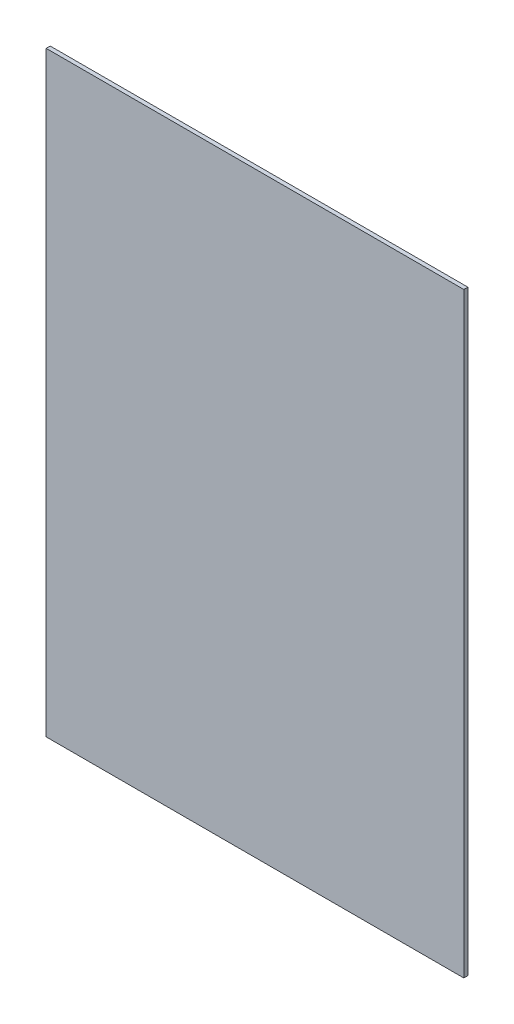
ISO-10303-21;
HEADER;
FILE_DESCRIPTION(('STEP AP214'),'2;1');
FILE_NAME('part.step','',(''),(''),'','','');
FILE_SCHEMA(('AUTOMOTIVE_DESIGN { 1 0 10303 214 1 1 1 1 }'));
ENDSEC;
DATA;
#1=APPLICATION_CONTEXT('core data for automotive mechanical design processes');
#2=APPLICATION_PROTOCOL_DEFINITION('international standard','automotive_design',2000,#1);
#3=PRODUCT_CONTEXT('',#1,'mechanical');
#4=PRODUCT('Part','Part','',(#3));
#5=PRODUCT_RELATED_PRODUCT_CATEGORY('part','',(#4));
#6=PRODUCT_DEFINITION_FORMATION('','',#4);
#7=PRODUCT_DEFINITION_CONTEXT('part definition',#1,'design');
#8=PRODUCT_DEFINITION('design','',#6,#7);
#9=PRODUCT_DEFINITION_SHAPE('','',#8);
#10=(LENGTH_UNIT() NAMED_UNIT(*) SI_UNIT(.MILLI.,.METRE.));
#11=(NAMED_UNIT(*) PLANE_ANGLE_UNIT() SI_UNIT($,.RADIAN.));
#12=(NAMED_UNIT(*) SI_UNIT($,.STERADIAN.) SOLID_ANGLE_UNIT());
#13=UNCERTAINTY_MEASURE_WITH_UNIT(LENGTH_MEASURE(1.E-05),#10,'distance_accuracy_value','');
#14=(GEOMETRIC_REPRESENTATION_CONTEXT(3) GLOBAL_UNCERTAINTY_ASSIGNED_CONTEXT((#13)) GLOBAL_UNIT_ASSIGNED_CONTEXT((#10,
#11,#12)) REPRESENTATION_CONTEXT('',''));
#15=CARTESIAN_POINT('',(0.,0.,0.));
#16=DIRECTION('',(0.,0.,1.));
#17=DIRECTION('',(1.,0.,0.));
#18=AXIS2_PLACEMENT_3D('',#15,#16,#17);
#19=CARTESIAN_POINT('',(8.22911255899184,0.,2.));
#20=DIRECTION('',(1.,0.,0.));
#21=DIRECTION('',(0.,0.,-1.));
#22=AXIS2_PLACEMENT_3D('',#19,#20,#21);
#23=PLANE('',#22);
#24=DIRECTION('',(0.,-1.,0.));
#25=VECTOR('',#24,1.);
#26=CARTESIAN_POINT('',(8.22911255899184,0.,0.));
#27=LINE('',#26,#25);
#28=CARTESIAN_POINT('',(8.22911255899184,0.,0.));
#29=VERTEX_POINT('',#28);
#30=CARTESIAN_POINT('',(8.22911255899184,-295.,0.));
#31=VERTEX_POINT('',#30);
#32=EDGE_CURVE('E97',#29,#31,#27,.T.);
#33=ORIENTED_EDGE('',*,*,#32,.T.);
#34=DIRECTION('',(0.,0.,-1.));
#35=VECTOR('',#34,1.);
#36=CARTESIAN_POINT('',(8.22911255899184,-295.,2.));
#37=LINE('',#36,#35);
#38=CARTESIAN_POINT('',(8.22911255899184,-295.,2.));
#39=VERTEX_POINT('',#38);
#40=EDGE_CURVE('E11',#39,#31,#37,.T.);
#41=ORIENTED_EDGE('',*,*,#40,.F.);
#42=DIRECTION('',(0.,-1.,0.));
#43=VECTOR('',#42,1.);
#44=CARTESIAN_POINT('',(8.22911255899184,0.,2.));
#45=LINE('',#44,#43);
#46=CARTESIAN_POINT('',(8.22911255899184,0.,2.));
#47=VERTEX_POINT('',#46);
#48=EDGE_CURVE('E85',#47,#39,#45,.T.);
#49=ORIENTED_EDGE('',*,*,#48,.F.);
#50=DIRECTION('',(0.,0.,-1.));
#51=VECTOR('',#50,1.);
#52=CARTESIAN_POINT('',(8.22911255899184,0.,2.));
#53=LINE('',#52,#51);
#54=EDGE_CURVE('E93',#47,#29,#53,.T.);
#55=ORIENTED_EDGE('',*,*,#54,.T.);
#56=EDGE_LOOP('',(#33,#41,#49,#55));
#57=FACE_BOUND('',#56,.T.);
#58=ADVANCED_FACE('F34',(#57),#23,.F.);
#59=CARTESIAN_POINT('',(8.22911255899184,-295.,2.));
#60=DIRECTION('',(0.,1.,0.));
#61=DIRECTION('',(0.,0.,1.));
#62=AXIS2_PLACEMENT_3D('',#59,#60,#61);
#63=PLANE('',#62);
#64=DIRECTION('',(1.,0.,0.));
#65=VECTOR('',#64,1.);
#66=CARTESIAN_POINT('',(8.22911255899184,-295.,0.));
#67=LINE('',#66,#65);
#68=CARTESIAN_POINT('',(214.851581944518,-295.,0.));
#69=VERTEX_POINT('',#68);
#70=EDGE_CURVE('E89',#31,#69,#67,.T.);
#71=ORIENTED_EDGE('',*,*,#70,.T.);
#72=DIRECTION('',(0.,0.,-1.));
#73=VECTOR('',#72,1.);
#74=CARTESIAN_POINT('',(214.851581944518,-295.,2.));
#75=LINE('',#74,#73);
#76=CARTESIAN_POINT('',(214.851581944518,-295.,2.));
#77=VERTEX_POINT('',#76);
#78=EDGE_CURVE('E42',#77,#69,#75,.T.);
#79=ORIENTED_EDGE('',*,*,#78,.F.);
#80=DIRECTION('',(1.,0.,0.));
#81=VECTOR('',#80,1.);
#82=CARTESIAN_POINT('',(8.22911255899184,-295.,2.));
#83=LINE('',#82,#81);
#84=EDGE_CURVE('E80',#39,#77,#83,.T.);
#85=ORIENTED_EDGE('',*,*,#84,.F.);
#86=ORIENTED_EDGE('',*,*,#40,.T.);
#87=EDGE_LOOP('',(#71,#79,#85,#86));
#88=FACE_BOUND('',#87,.T.);
#89=ADVANCED_FACE('F88',(#88),#63,.F.);
#90=CARTESIAN_POINT('',(214.851581944518,0.,2.));
#91=DIRECTION('',(-1.,0.,0.));
#92=DIRECTION('',(0.,0.,1.));
#93=AXIS2_PLACEMENT_3D('',#90,#91,#92);
#94=PLANE('',#93);
#95=DIRECTION('',(0.,1.,0.));
#96=VECTOR('',#95,1.);
#97=CARTESIAN_POINT('',(214.851581944518,0.,0.));
#98=LINE('',#97,#96);
#99=CARTESIAN_POINT('',(214.851581944518,0.,0.));
#100=VERTEX_POINT('',#99);
#101=EDGE_CURVE('E67',#69,#100,#98,.T.);
#102=ORIENTED_EDGE('',*,*,#101,.T.);
#103=DIRECTION('',(0.,0.,-1.));
#104=VECTOR('',#103,1.);
#105=CARTESIAN_POINT('',(214.851581944518,0.,2.));
#106=LINE('',#105,#104);
#107=CARTESIAN_POINT('',(214.851581944518,0.,2.));
#108=VERTEX_POINT('',#107);
#109=EDGE_CURVE('E90',#108,#100,#106,.T.);
#110=ORIENTED_EDGE('',*,*,#109,.F.);
#111=DIRECTION('',(0.,1.,0.));
#112=VECTOR('',#111,1.);
#113=CARTESIAN_POINT('',(214.851581944518,0.,2.));
#114=LINE('',#113,#112);
#115=EDGE_CURVE('E83',#77,#108,#114,.T.);
#116=ORIENTED_EDGE('',*,*,#115,.F.);
#117=ORIENTED_EDGE('',*,*,#78,.T.);
#118=EDGE_LOOP('',(#102,#110,#116,#117));
#119=FACE_BOUND('',#118,.T.);
#120=ADVANCED_FACE('F91',(#119),#94,.F.);
#121=CARTESIAN_POINT('',(8.22911255899184,0.,2.));
#122=DIRECTION('',(0.,-1.,0.));
#123=DIRECTION('',(0.,0.,-1.));
#124=AXIS2_PLACEMENT_3D('',#121,#122,#123);
#125=PLANE('',#124);
#126=DIRECTION('',(-1.,0.,0.));
#127=VECTOR('',#126,1.);
#128=CARTESIAN_POINT('',(8.22911255899184,0.,0.));
#129=LINE('',#128,#127);
#130=EDGE_CURVE('E73',#100,#29,#129,.T.);
#131=ORIENTED_EDGE('',*,*,#130,.T.);
#132=ORIENTED_EDGE('',*,*,#54,.F.);
#133=DIRECTION('',(-1.,0.,0.));
#134=VECTOR('',#133,1.);
#135=CARTESIAN_POINT('',(8.22911255899184,0.,2.));
#136=LINE('',#135,#134);
#137=EDGE_CURVE('E50',#108,#47,#136,.T.);
#138=ORIENTED_EDGE('',*,*,#137,.F.);
#139=ORIENTED_EDGE('',*,*,#109,.T.);
#140=EDGE_LOOP('',(#131,#132,#138,#139));
#141=FACE_BOUND('',#140,.T.);
#142=ADVANCED_FACE('F104',(#141),#125,.F.);
#143=CARTESIAN_POINT('',(0.,0.,2.));
#144=DIRECTION('',(0.,0.,1.));
#145=DIRECTION('',(1.,0.,0.));
#146=AXIS2_PLACEMENT_3D('',#143,#144,#145);
#147=PLANE('',#146);
#148=ORIENTED_EDGE('',*,*,#48,.T.);
#149=ORIENTED_EDGE('',*,*,#84,.T.);
#150=ORIENTED_EDGE('',*,*,#115,.T.);
#151=ORIENTED_EDGE('',*,*,#137,.T.);
#152=EDGE_LOOP('',(#148,#149,#150,#151));
#153=FACE_BOUND('',#152,.T.);
#154=ADVANCED_FACE('F81',(#153),#147,.T.);
#155=CARTESIAN_POINT('',(0.,0.,0.));
#156=DIRECTION('',(0.,0.,1.));
#157=DIRECTION('',(1.,0.,0.));
#158=AXIS2_PLACEMENT_3D('',#155,#156,#157);
#159=PLANE('',#158);
#160=ORIENTED_EDGE('',*,*,#32,.F.);
#161=ORIENTED_EDGE('',*,*,#130,.F.);
#162=ORIENTED_EDGE('',*,*,#101,.F.);
#163=ORIENTED_EDGE('',*,*,#70,.F.);
#164=EDGE_LOOP('',(#160,#161,#162,#163));
#165=FACE_BOUND('',#164,.T.);
#166=ADVANCED_FACE('F107',(#165),#159,.F.);
#167=CLOSED_SHELL('',(#58,#89,#120,#142,#154,#166));
#168=MANIFOLD_SOLID_BREP('B2',#167);
#169=ADVANCED_BREP_SHAPE_REPRESENTATION('',(#18,#168),#14);
#170=SHAPE_DEFINITION_REPRESENTATION(#9,#169);
ENDSEC;
END-ISO-10303-21;
